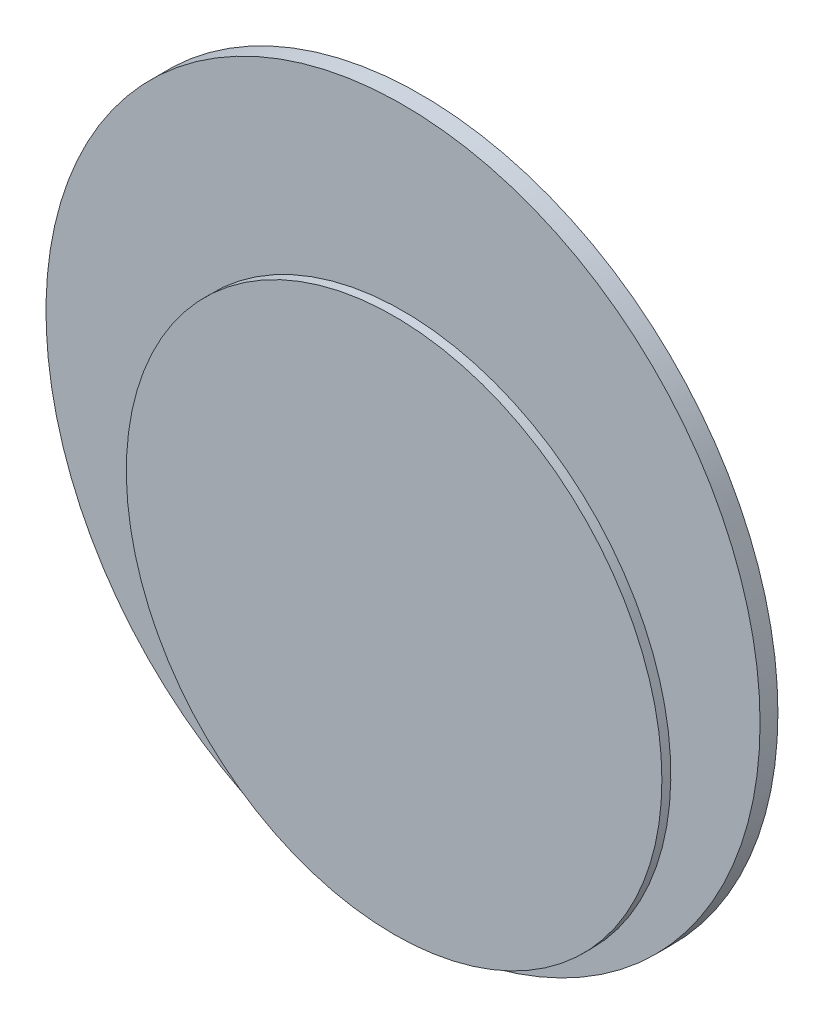
ISO-10303-21;
HEADER;
FILE_DESCRIPTION(('STEP AP214'),'2;1');
FILE_NAME('part.step','',(''),(''),'','','');
FILE_SCHEMA(('AUTOMOTIVE_DESIGN { 1 0 10303 214 1 1 1 1 }'));
ENDSEC;
DATA;
#1=APPLICATION_CONTEXT('core data for automotive mechanical design processes');
#2=APPLICATION_PROTOCOL_DEFINITION('international standard','automotive_design',2000,#1);
#3=PRODUCT_CONTEXT('',#1,'mechanical');
#4=PRODUCT('Part','Part','',(#3));
#5=PRODUCT_RELATED_PRODUCT_CATEGORY('part','',(#4));
#6=PRODUCT_DEFINITION_FORMATION('','',#4);
#7=PRODUCT_DEFINITION_CONTEXT('part definition',#1,'design');
#8=PRODUCT_DEFINITION('design','',#6,#7);
#9=PRODUCT_DEFINITION_SHAPE('','',#8);
#10=(LENGTH_UNIT() NAMED_UNIT(*) SI_UNIT(.MILLI.,.METRE.));
#11=(NAMED_UNIT(*) PLANE_ANGLE_UNIT() SI_UNIT($,.RADIAN.));
#12=(NAMED_UNIT(*) SI_UNIT($,.STERADIAN.) SOLID_ANGLE_UNIT());
#13=UNCERTAINTY_MEASURE_WITH_UNIT(LENGTH_MEASURE(1.E-05),#10,'distance_accuracy_value','');
#14=(GEOMETRIC_REPRESENTATION_CONTEXT(3) GLOBAL_UNCERTAINTY_ASSIGNED_CONTEXT((#13)) GLOBAL_UNIT_ASSIGNED_CONTEXT((#10,
#11,#12)) REPRESENTATION_CONTEXT('',''));
#15=CARTESIAN_POINT('',(0.,0.,0.));
#16=DIRECTION('',(0.,0.,1.));
#17=DIRECTION('',(1.,0.,0.));
#18=AXIS2_PLACEMENT_3D('',#15,#16,#17);
#19=CARTESIAN_POINT('',(0.,0.,-1.));
#20=DIRECTION('',(0.,0.,1.));
#21=DIRECTION('',(1.,0.,0.));
#22=AXIS2_PLACEMENT_3D('',#19,#20,#21);
#23=CYLINDRICAL_SURFACE('',#22,20.);
#24=CARTESIAN_POINT('',(0.,0.,-1.));
#25=DIRECTION('',(0.,0.,1.));
#26=DIRECTION('',(1.,0.,0.));
#27=AXIS2_PLACEMENT_3D('',#24,#25,#26);
#28=CIRCLE('',#27,20.);
#29=CARTESIAN_POINT('',(20.,0.,-1.));
#30=VERTEX_POINT('',#29);
#31=EDGE_CURVE('E11',#30,#30,#28,.T.);
#32=ORIENTED_EDGE('',*,*,#31,.T.);
#33=EDGE_LOOP('',(#32));
#34=FACE_BOUND('',#33,.T.);
#35=CARTESIAN_POINT('',(0.,0.,0.));
#36=DIRECTION('',(0.,0.,1.));
#37=DIRECTION('',(1.,0.,0.));
#38=AXIS2_PLACEMENT_3D('',#35,#36,#37);
#39=CIRCLE('',#38,20.);
#40=CARTESIAN_POINT('',(0.,-20.,0.));
#41=VERTEX_POINT('',#40);
#42=EDGE_CURVE('E38',#41,#41,#39,.T.);
#43=ORIENTED_EDGE('',*,*,#42,.F.);
#44=EDGE_LOOP('',(#43));
#45=FACE_BOUND('',#44,.T.);
#46=ADVANCED_FACE('F35',(#34,#45),#23,.T.);
#47=CARTESIAN_POINT('',(0.,0.,-1.));
#48=DIRECTION('',(0.,0.,1.));
#49=DIRECTION('',(1.,0.,0.));
#50=AXIS2_PLACEMENT_3D('',#47,#48,#49);
#51=PLANE('',#50);
#52=ORIENTED_EDGE('',*,*,#31,.F.);
#53=EDGE_LOOP('',(#52));
#54=FACE_BOUND('',#53,.T.);
#55=ADVANCED_FACE('F59',(#54),#51,.F.);
#56=CARTESIAN_POINT('',(0.,0.,0.));
#57=DIRECTION('',(0.,0.,1.));
#58=DIRECTION('',(1.,0.,0.));
#59=AXIS2_PLACEMENT_3D('',#56,#57,#58);
#60=PLANE('',#59);
#61=ORIENTED_EDGE('',*,*,#42,.T.);
#62=CARTESIAN_POINT('',(0.,-5.,0.));
#63=DIRECTION('',(0.,0.,1.));
#64=DIRECTION('',(1.,0.,0.));
#65=AXIS2_PLACEMENT_3D('',#62,#63,#64);
#66=CIRCLE('',#65,15.);
#67=EDGE_CURVE('E49',#41,#41,#66,.T.);
#68=ORIENTED_EDGE('',*,*,#67,.F.);
#69=EDGE_LOOP('',(#61,#68));
#70=FACE_BOUND('',#69,.T.);
#71=ADVANCED_FACE('F57',(#70),#60,.T.);
#72=CARTESIAN_POINT('',(0.,-5.,0.5));
#73=DIRECTION('',(0.,0.,-1.));
#74=DIRECTION('',(-1.,0.,0.));
#75=AXIS2_PLACEMENT_3D('',#72,#73,#74);
#76=CYLINDRICAL_SURFACE('',#75,15.);
#77=CARTESIAN_POINT('',(0.,-5.,0.5));
#78=DIRECTION('',(0.,0.,1.));
#79=DIRECTION('',(1.,0.,0.));
#80=AXIS2_PLACEMENT_3D('',#77,#78,#79);
#81=CIRCLE('',#80,15.);
#82=CARTESIAN_POINT('',(15.,-5.,0.5));
#83=VERTEX_POINT('',#82);
#84=EDGE_CURVE('E47',#83,#83,#81,.T.);
#85=ORIENTED_EDGE('',*,*,#84,.F.);
#86=EDGE_LOOP('',(#85));
#87=FACE_BOUND('',#86,.T.);
#88=ORIENTED_EDGE('',*,*,#67,.T.);
#89=EDGE_LOOP('',(#88));
#90=FACE_BOUND('',#89,.T.);
#91=ADVANCED_FACE('F56',(#87,#90),#76,.T.);
#92=CARTESIAN_POINT('',(0.,-5.,0.5));
#93=DIRECTION('',(0.,0.,1.));
#94=DIRECTION('',(1.,0.,0.));
#95=AXIS2_PLACEMENT_3D('',#92,#93,#94);
#96=PLANE('',#95);
#97=ORIENTED_EDGE('',*,*,#84,.T.);
#98=EDGE_LOOP('',(#97));
#99=FACE_BOUND('',#98,.T.);
#100=ADVANCED_FACE('F64',(#99),#96,.T.);
#101=CLOSED_SHELL('',(#46,#55,#71,#91,#100));
#102=MANIFOLD_SOLID_BREP('B2',#101);
#103=ADVANCED_BREP_SHAPE_REPRESENTATION('',(#18,#102),#14);
#104=SHAPE_DEFINITION_REPRESENTATION(#9,#103);
ENDSEC;
END-ISO-10303-21;
